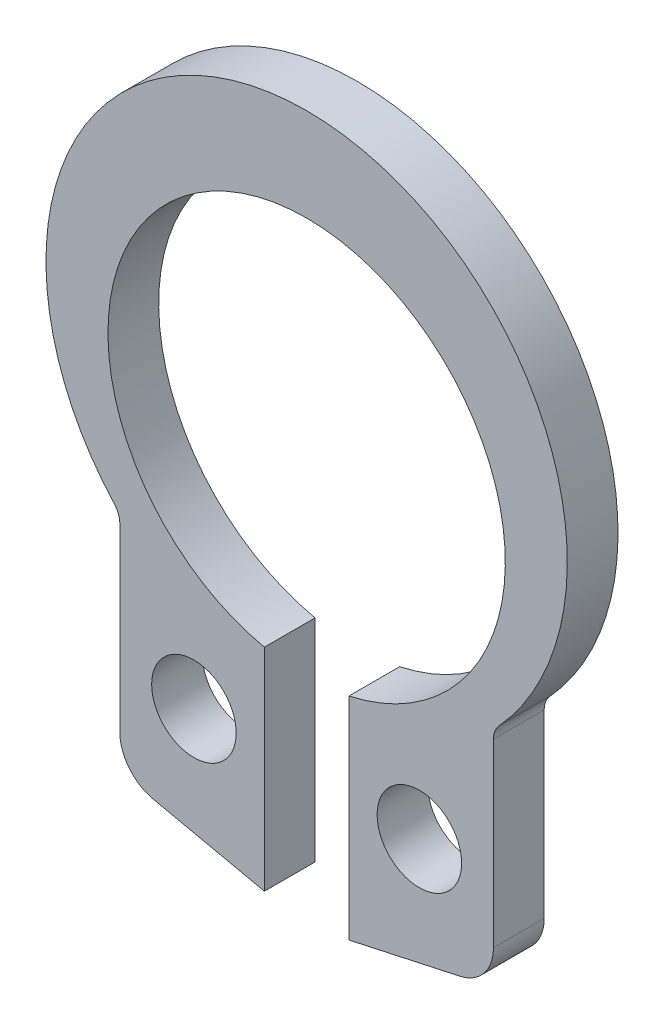
ISO-10303-21;
HEADER;
FILE_DESCRIPTION(('STEP AP214'),'2;1');
FILE_NAME('part.step','',(''),(''),'','','');
FILE_SCHEMA(('AUTOMOTIVE_DESIGN { 1 0 10303 214 1 1 1 1 }'));
ENDSEC;
DATA;
#1=APPLICATION_CONTEXT('core data for automotive mechanical design processes');
#2=APPLICATION_PROTOCOL_DEFINITION('international standard','automotive_design',2000,#1);
#3=PRODUCT_CONTEXT('',#1,'mechanical');
#4=PRODUCT('Part','Part','',(#3));
#5=PRODUCT_RELATED_PRODUCT_CATEGORY('part','',(#4));
#6=PRODUCT_DEFINITION_FORMATION('','',#4);
#7=PRODUCT_DEFINITION_CONTEXT('part definition',#1,'design');
#8=PRODUCT_DEFINITION('design','',#6,#7);
#9=PRODUCT_DEFINITION_SHAPE('','',#8);
#10=(LENGTH_UNIT() NAMED_UNIT(*) SI_UNIT(.MILLI.,.METRE.));
#11=(NAMED_UNIT(*) PLANE_ANGLE_UNIT() SI_UNIT($,.RADIAN.));
#12=(NAMED_UNIT(*) SI_UNIT($,.STERADIAN.) SOLID_ANGLE_UNIT());
#13=UNCERTAINTY_MEASURE_WITH_UNIT(LENGTH_MEASURE(1.E-05),#10,'distance_accuracy_value','');
#14=(GEOMETRIC_REPRESENTATION_CONTEXT(3) GLOBAL_UNCERTAINTY_ASSIGNED_CONTEXT((#13)) GLOBAL_UNIT_ASSIGNED_CONTEXT((#10,
#11,#12)) REPRESENTATION_CONTEXT('',''));
#15=CARTESIAN_POINT('',(0.,0.,0.));
#16=DIRECTION('',(0.,0.,1.));
#17=DIRECTION('',(1.,0.,0.));
#18=AXIS2_PLACEMENT_3D('',#15,#16,#17);
#19=CARTESIAN_POINT('',(1.70993058558373,-4.02101128552295,-0.3));
#20=DIRECTION('',(0.,0.,1.));
#21=DIRECTION('',(1.,0.,0.));
#22=AXIS2_PLACEMENT_3D('',#19,#20,#21);
#23=CYLINDRICAL_SURFACE('',#22,0.5);
#24=CARTESIAN_POINT('',(1.70993058558373,-4.02101128552295,-0.3));
#25=DIRECTION('',(0.,0.,-1.));
#26=DIRECTION('',(-1.,0.,0.));
#27=AXIS2_PLACEMENT_3D('',#24,#25,#26);
#28=CIRCLE('',#27,0.5);
#29=CARTESIAN_POINT('',(2.20993058558373,-4.02101128552295,-0.3));
#30=VERTEX_POINT('',#29);
#31=CARTESIAN_POINT('',(1.81631356430713,-4.50956288140402,-0.3));
#32=VERTEX_POINT('',#31);
#33=EDGE_CURVE('E242',#30,#32,#28,.T.);
#34=ORIENTED_EDGE('',*,*,#33,.F.);
#35=DIRECTION('',(0.,0.,-1.));
#36=VECTOR('',#35,1.);
#37=CARTESIAN_POINT('',(2.20993058558373,-4.02101128552295,-0.3));
#38=LINE('',#37,#36);
#39=CARTESIAN_POINT('',(2.20993058558373,-4.02101128552295,0.3));
#40=VERTEX_POINT('',#39);
#41=EDGE_CURVE('E110',#40,#30,#38,.T.);
#42=ORIENTED_EDGE('',*,*,#41,.F.);
#43=CARTESIAN_POINT('',(1.70993058558373,-4.02101128552295,0.3));
#44=DIRECTION('',(0.,0.,1.));
#45=DIRECTION('',(-1.,0.,0.));
#46=AXIS2_PLACEMENT_3D('',#43,#44,#45);
#47=CIRCLE('',#46,0.5);
#48=CARTESIAN_POINT('',(1.81631356430713,-4.50956288140402,0.3));
#49=VERTEX_POINT('',#48);
#50=EDGE_CURVE('E266',#49,#40,#47,.T.);
#51=ORIENTED_EDGE('',*,*,#50,.F.);
#52=DIRECTION('',(0.,0.,1.));
#53=VECTOR('',#52,1.);
#54=CARTESIAN_POINT('',(1.81631356430713,-4.50956288140402,-0.3));
#55=LINE('',#54,#53);
#56=EDGE_CURVE('E10',#32,#49,#55,.T.);
#57=ORIENTED_EDGE('',*,*,#56,.F.);
#58=EDGE_LOOP('',(#34,#42,#51,#57));
#59=FACE_BOUND('',#58,.T.);
#60=ADVANCED_FACE('F15',(#59),#23,.T.);
#61=CARTESIAN_POINT('',(2.45993058558373,-1.88274495089487,0.3));
#62=DIRECTION('',(0.,0.,-1.));
#63=DIRECTION('',(-1.,0.,0.));
#64=AXIS2_PLACEMENT_3D('',#61,#62,#63);
#65=CYLINDRICAL_SURFACE('',#64,0.25);
#66=CARTESIAN_POINT('',(2.45993058558373,-1.88274495089487,-0.3));
#67=DIRECTION('',(0.,0.,1.));
#68=DIRECTION('',(-1.,0.,0.));
#69=AXIS2_PLACEMENT_3D('',#66,#67,#68);
#70=CIRCLE('',#69,0.25);
#71=CARTESIAN_POINT('',(2.27543579166495,-1.71403907957775,-0.3));
#72=VERTEX_POINT('',#71);
#73=CARTESIAN_POINT('',(2.20993058558373,-1.88274495089487,-0.3));
#74=VERTEX_POINT('',#73);
#75=EDGE_CURVE('E165',#72,#74,#70,.T.);
#76=ORIENTED_EDGE('',*,*,#75,.F.);
#77=DIRECTION('',(0.,0.,-1.));
#78=VECTOR('',#77,1.);
#79=CARTESIAN_POINT('',(2.27543579166495,-1.71403907957775,0.3));
#80=LINE('',#79,#78);
#81=CARTESIAN_POINT('',(2.27543579166495,-1.71403907957775,0.3));
#82=VERTEX_POINT('',#81);
#83=EDGE_CURVE('E169',#82,#72,#80,.T.);
#84=ORIENTED_EDGE('',*,*,#83,.F.);
#85=CARTESIAN_POINT('',(2.45993058558373,-1.88274495089487,0.3));
#86=DIRECTION('',(0.,0.,-1.));
#87=DIRECTION('',(-1.,0.,0.));
#88=AXIS2_PLACEMENT_3D('',#85,#86,#87);
#89=CIRCLE('',#88,0.25);
#90=CARTESIAN_POINT('',(2.20993058558373,-1.88274495089487,0.3));
#91=VERTEX_POINT('',#90);
#92=EDGE_CURVE('E162',#91,#82,#89,.T.);
#93=ORIENTED_EDGE('',*,*,#92,.F.);
#94=DIRECTION('',(0.,0.,1.));
#95=VECTOR('',#94,1.);
#96=CARTESIAN_POINT('',(2.20993058558373,-1.88274495089487,-0.3));
#97=LINE('',#96,#95);
#98=EDGE_CURVE('E26',#74,#91,#97,.T.);
#99=ORIENTED_EDGE('',*,*,#98,.F.);
#100=EDGE_LOOP('',(#76,#84,#93,#99));
#101=FACE_BOUND('',#100,.T.);
#102=ADVANCED_FACE('F167',(#101),#65,.F.);
#103=CARTESIAN_POINT('',(1.33333333333333,-3.34398298772919,2.5));
#104=DIRECTION('',(0.,0.,-1.));
#105=DIRECTION('',(-1.,0.,0.));
#106=AXIS2_PLACEMENT_3D('',#103,#104,#105);
#107=CYLINDRICAL_SURFACE('',#106,0.5);
#108=CARTESIAN_POINT('',(1.33333333333333,-3.34398298772919,0.3));
#109=DIRECTION('',(0.,0.,-1.));
#110=DIRECTION('',(-1.,0.,0.));
#111=AXIS2_PLACEMENT_3D('',#108,#109,#110);
#112=CIRCLE('',#111,0.5);
#113=CARTESIAN_POINT('',(0.833333333333332,-3.34398298772919,0.3));
#114=VERTEX_POINT('',#113);
#115=EDGE_CURVE('E204',#114,#114,#112,.T.);
#116=ORIENTED_EDGE('',*,*,#115,.F.);
#117=EDGE_LOOP('',(#116));
#118=FACE_BOUND('',#117,.T.);
#119=CARTESIAN_POINT('',(1.33333333333333,-3.34398298772919,-0.3));
#120=DIRECTION('',(0.,0.,-1.));
#121=DIRECTION('',(-1.,0.,0.));
#122=AXIS2_PLACEMENT_3D('',#119,#120,#121);
#123=CIRCLE('',#122,0.5);
#124=CARTESIAN_POINT('',(0.833333333333332,-3.34398298772919,-0.3));
#125=VERTEX_POINT('',#124);
#126=EDGE_CURVE('E221',#125,#125,#123,.T.);
#127=ORIENTED_EDGE('',*,*,#126,.T.);
#128=EDGE_LOOP('',(#127));
#129=FACE_BOUND('',#128,.T.);
#130=ADVANCED_FACE('F390',(#118,#129),#107,.F.);
#131=CARTESIAN_POINT('',(2.20993058558373,-4.42385207510909,-0.3));
#132=DIRECTION('',(-0.212765957446809,0.97710319176213,0.));
#133=DIRECTION('',(0.,0.,1.));
#134=AXIS2_PLACEMENT_3D('',#131,#132,#133);
#135=PLANE('',#134);
#136=DIRECTION('',(-0.977103191762131,-0.212765957446809,0.));
#137=VECTOR('',#136,1.);
#138=CARTESIAN_POINT('',(2.20993058558373,-4.42385207510909,-0.3));
#139=LINE('',#138,#137);
#140=CARTESIAN_POINT('',(0.5,-4.79619250064101,-0.3));
#141=VERTEX_POINT('',#140);
#142=EDGE_CURVE('E209',#32,#141,#139,.T.);
#143=ORIENTED_EDGE('',*,*,#142,.F.);
#144=ORIENTED_EDGE('',*,*,#56,.T.);
#145=DIRECTION('',(-0.977103191762131,-0.212765957446809,0.));
#146=VECTOR('',#145,1.);
#147=CARTESIAN_POINT('',(2.20993058558373,-4.42385207510909,0.3));
#148=LINE('',#147,#146);
#149=CARTESIAN_POINT('',(0.5,-4.79619250064101,0.3));
#150=VERTEX_POINT('',#149);
#151=EDGE_CURVE('E203',#49,#150,#148,.T.);
#152=ORIENTED_EDGE('',*,*,#151,.T.);
#153=DIRECTION('',(0.,0.,1.));
#154=VECTOR('',#153,1.);
#155=CARTESIAN_POINT('',(0.5,-4.79619250064101,-0.3));
#156=LINE('',#155,#154);
#157=EDGE_CURVE('E125',#141,#150,#156,.T.);
#158=ORIENTED_EDGE('',*,*,#157,.F.);
#159=EDGE_LOOP('',(#143,#144,#152,#158));
#160=FACE_BOUND('',#159,.T.);
#161=ADVANCED_FACE('F380',(#160),#135,.F.);
#162=CARTESIAN_POINT('',(2.20993058558373,-1.78348478180063,-0.3));
#163=DIRECTION('',(-1.,0.,0.));
#164=DIRECTION('',(0.,0.,1.));
#165=AXIS2_PLACEMENT_3D('',#162,#163,#164);
#166=PLANE('',#165);
#167=DIRECTION('',(0.,-1.,0.));
#168=VECTOR('',#167,1.);
#169=CARTESIAN_POINT('',(2.20993058558373,-1.78348478180063,0.3));
#170=LINE('',#169,#168);
#171=EDGE_CURVE('E258',#91,#40,#170,.T.);
#172=ORIENTED_EDGE('',*,*,#171,.T.);
#173=ORIENTED_EDGE('',*,*,#41,.T.);
#174=DIRECTION('',(0.,-1.,0.));
#175=VECTOR('',#174,1.);
#176=CARTESIAN_POINT('',(2.20993058558373,-1.78348478180063,-0.3));
#177=LINE('',#176,#175);
#178=EDGE_CURVE('E240',#74,#30,#177,.T.);
#179=ORIENTED_EDGE('',*,*,#178,.F.);
#180=ORIENTED_EDGE('',*,*,#98,.T.);
#181=EDGE_LOOP('',(#172,#173,#179,#180));
#182=FACE_BOUND('',#181,.T.);
#183=ADVANCED_FACE('F382',(#182),#166,.F.);
#184=CARTESIAN_POINT('',(-1.70993058558373,-4.02101128552295,-0.3));
#185=DIRECTION('',(0.,0.,1.));
#186=DIRECTION('',(1.,0.,0.));
#187=AXIS2_PLACEMENT_3D('',#184,#185,#186);
#188=CYLINDRICAL_SURFACE('',#187,0.5);
#189=CARTESIAN_POINT('',(-1.70993058558373,-4.02101128552295,-0.3));
#190=DIRECTION('',(0.,0.,-1.));
#191=DIRECTION('',(-1.,0.,0.));
#192=AXIS2_PLACEMENT_3D('',#189,#190,#191);
#193=CIRCLE('',#192,0.5);
#194=CARTESIAN_POINT('',(-1.81631356430713,-4.50956288140402,-0.3));
#195=VERTEX_POINT('',#194);
#196=CARTESIAN_POINT('',(-2.20993058558373,-4.02101128552295,-0.3));
#197=VERTEX_POINT('',#196);
#198=EDGE_CURVE('E226',#195,#197,#193,.T.);
#199=ORIENTED_EDGE('',*,*,#198,.F.);
#200=DIRECTION('',(0.,0.,-1.));
#201=VECTOR('',#200,1.);
#202=CARTESIAN_POINT('',(-1.81631356430713,-4.50956288140402,-0.3));
#203=LINE('',#202,#201);
#204=CARTESIAN_POINT('',(-1.81631356430713,-4.50956288140402,0.3));
#205=VERTEX_POINT('',#204);
#206=EDGE_CURVE('E230',#205,#195,#203,.T.);
#207=ORIENTED_EDGE('',*,*,#206,.F.);
#208=CARTESIAN_POINT('',(-1.70993058558373,-4.02101128552295,0.3));
#209=DIRECTION('',(0.,0.,1.));
#210=DIRECTION('',(-1.,0.,0.));
#211=AXIS2_PLACEMENT_3D('',#208,#209,#210);
#212=CIRCLE('',#211,0.5);
#213=CARTESIAN_POINT('',(-2.20993058558373,-4.02101128552295,0.3));
#214=VERTEX_POINT('',#213);
#215=EDGE_CURVE('E273',#214,#205,#212,.T.);
#216=ORIENTED_EDGE('',*,*,#215,.F.);
#217=DIRECTION('',(0.,0.,1.));
#218=VECTOR('',#217,1.);
#219=CARTESIAN_POINT('',(-2.20993058558373,-4.02101128552295,-0.3));
#220=LINE('',#219,#218);
#221=EDGE_CURVE('E227',#197,#214,#220,.T.);
#222=ORIENTED_EDGE('',*,*,#221,.F.);
#223=EDGE_LOOP('',(#199,#207,#216,#222));
#224=FACE_BOUND('',#223,.T.);
#225=ADVANCED_FACE('F322',(#224),#188,.T.);
#226=CARTESIAN_POINT('',(-2.45993058558373,-1.88274495089487,0.3));
#227=DIRECTION('',(0.,0.,-1.));
#228=DIRECTION('',(-1.,0.,0.));
#229=AXIS2_PLACEMENT_3D('',#226,#227,#228);
#230=CYLINDRICAL_SURFACE('',#229,0.25);
#231=CARTESIAN_POINT('',(-2.45993058558373,-1.88274495089487,-0.3));
#232=DIRECTION('',(0.,0.,1.));
#233=DIRECTION('',(-1.,0.,0.));
#234=AXIS2_PLACEMENT_3D('',#231,#232,#233);
#235=CIRCLE('',#234,0.25);
#236=CARTESIAN_POINT('',(-2.20993058558373,-1.88274495089487,-0.3));
#237=VERTEX_POINT('',#236);
#238=CARTESIAN_POINT('',(-2.27543579166495,-1.71403907957775,-0.3));
#239=VERTEX_POINT('',#238);
#240=EDGE_CURVE('E175',#237,#239,#235,.T.);
#241=ORIENTED_EDGE('',*,*,#240,.F.);
#242=DIRECTION('',(0.,0.,-1.));
#243=VECTOR('',#242,1.);
#244=CARTESIAN_POINT('',(-2.20993058558373,-1.88274495089487,-0.3));
#245=LINE('',#244,#243);
#246=CARTESIAN_POINT('',(-2.20993058558373,-1.88274495089487,0.3));
#247=VERTEX_POINT('',#246);
#248=EDGE_CURVE('E40',#247,#237,#245,.T.);
#249=ORIENTED_EDGE('',*,*,#248,.F.);
#250=CARTESIAN_POINT('',(-2.45993058558373,-1.88274495089487,0.3));
#251=DIRECTION('',(0.,0.,-1.));
#252=DIRECTION('',(-1.,0.,0.));
#253=AXIS2_PLACEMENT_3D('',#250,#251,#252);
#254=CIRCLE('',#253,0.25);
#255=CARTESIAN_POINT('',(-2.27543579166495,-1.71403907957775,0.3));
#256=VERTEX_POINT('',#255);
#257=EDGE_CURVE('E257',#256,#247,#254,.T.);
#258=ORIENTED_EDGE('',*,*,#257,.F.);
#259=DIRECTION('',(0.,0.,1.));
#260=VECTOR('',#259,1.);
#261=CARTESIAN_POINT('',(-2.27543579166495,-1.71403907957775,0.3));
#262=LINE('',#261,#260);
#263=EDGE_CURVE('E186',#239,#256,#262,.T.);
#264=ORIENTED_EDGE('',*,*,#263,.F.);
#265=EDGE_LOOP('',(#241,#249,#258,#264));
#266=FACE_BOUND('',#265,.T.);
#267=ADVANCED_FACE('F317',(#266),#230,.F.);
#268=CARTESIAN_POINT('',(-1.33333333333333,-3.34398298772919,2.5));
#269=DIRECTION('',(0.,0.,-1.));
#270=DIRECTION('',(-1.,0.,0.));
#271=AXIS2_PLACEMENT_3D('',#268,#269,#270);
#272=CYLINDRICAL_SURFACE('',#271,0.5);
#273=CARTESIAN_POINT('',(-1.33333333333333,-3.34398298772919,0.3));
#274=DIRECTION('',(0.,0.,-1.));
#275=DIRECTION('',(-1.,0.,0.));
#276=AXIS2_PLACEMENT_3D('',#273,#274,#275);
#277=CIRCLE('',#276,0.5);
#278=CARTESIAN_POINT('',(-1.83333333333333,-3.34398298772919,0.3));
#279=VERTEX_POINT('',#278);
#280=EDGE_CURVE('E200',#279,#279,#277,.T.);
#281=ORIENTED_EDGE('',*,*,#280,.F.);
#282=EDGE_LOOP('',(#281));
#283=FACE_BOUND('',#282,.T.);
#284=CARTESIAN_POINT('',(-1.33333333333333,-3.34398298772919,-0.3));
#285=DIRECTION('',(0.,0.,-1.));
#286=DIRECTION('',(-1.,0.,0.));
#287=AXIS2_PLACEMENT_3D('',#284,#285,#286);
#288=CIRCLE('',#287,0.5);
#289=CARTESIAN_POINT('',(-1.83333333333333,-3.34398298772919,-0.3));
#290=VERTEX_POINT('',#289);
#291=EDGE_CURVE('E83',#290,#290,#288,.T.);
#292=ORIENTED_EDGE('',*,*,#291,.T.);
#293=EDGE_LOOP('',(#292));
#294=FACE_BOUND('',#293,.T.);
#295=ADVANCED_FACE('F401',(#283,#294),#272,.F.);
#296=CARTESIAN_POINT('',(-2.20993058558373,-4.42385207510909,-0.3));
#297=DIRECTION('',(1.,0.,0.));
#298=DIRECTION('',(0.,1.,0.));
#299=AXIS2_PLACEMENT_3D('',#296,#297,#298);
#300=PLANE('',#299);
#301=DIRECTION('',(0.,1.,0.));
#302=VECTOR('',#301,1.);
#303=CARTESIAN_POINT('',(-2.20993058558373,-4.42385207510909,-0.3));
#304=LINE('',#303,#302);
#305=EDGE_CURVE('E223',#197,#237,#304,.T.);
#306=ORIENTED_EDGE('',*,*,#305,.F.);
#307=ORIENTED_EDGE('',*,*,#221,.T.);
#308=DIRECTION('',(0.,1.,0.));
#309=VECTOR('',#308,1.);
#310=CARTESIAN_POINT('',(-2.20993058558373,-4.42385207510909,0.3));
#311=LINE('',#310,#309);
#312=EDGE_CURVE('E298',#214,#247,#311,.T.);
#313=ORIENTED_EDGE('',*,*,#312,.T.);
#314=ORIENTED_EDGE('',*,*,#248,.T.);
#315=EDGE_LOOP('',(#306,#307,#313,#314));
#316=FACE_BOUND('',#315,.T.);
#317=ADVANCED_FACE('F311',(#316),#300,.F.);
#318=CARTESIAN_POINT('',(-0.5,-4.79619250064101,-0.3));
#319=DIRECTION('',(0.212765957446809,0.97710319176213,0.));
#320=DIRECTION('',(0.,0.,-1.));
#321=AXIS2_PLACEMENT_3D('',#318,#319,#320);
#322=PLANE('',#321);
#323=DIRECTION('',(-0.977103191762131,0.212765957446809,0.));
#324=VECTOR('',#323,1.);
#325=CARTESIAN_POINT('',(-0.5,-4.79619250064101,0.3));
#326=LINE('',#325,#324);
#327=CARTESIAN_POINT('',(-0.5,-4.79619250064101,0.3));
#328=VERTEX_POINT('',#327);
#329=EDGE_CURVE('E269',#328,#205,#326,.T.);
#330=ORIENTED_EDGE('',*,*,#329,.T.);
#331=ORIENTED_EDGE('',*,*,#206,.T.);
#332=DIRECTION('',(-0.977103191762131,0.212765957446809,0.));
#333=VECTOR('',#332,1.);
#334=CARTESIAN_POINT('',(-0.5,-4.79619250064101,-0.3));
#335=LINE('',#334,#333);
#336=CARTESIAN_POINT('',(-0.5,-4.79619250064101,-0.3));
#337=VERTEX_POINT('',#336);
#338=EDGE_CURVE('E212',#337,#195,#335,.T.);
#339=ORIENTED_EDGE('',*,*,#338,.F.);
#340=DIRECTION('',(0.,0.,1.));
#341=VECTOR('',#340,1.);
#342=CARTESIAN_POINT('',(-0.5,-4.79619250064101,-0.3));
#343=LINE('',#342,#341);
#344=EDGE_CURVE('E262',#337,#328,#343,.T.);
#345=ORIENTED_EDGE('',*,*,#344,.T.);
#346=EDGE_LOOP('',(#330,#331,#339,#345));
#347=FACE_BOUND('',#346,.T.);
#348=ADVANCED_FACE('F17',(#347),#322,.F.);
#349=CARTESIAN_POINT('',(-0.5,-2.71666666666667,2.8));
#350=DIRECTION('',(-1.,0.,0.));
#351=DIRECTION('',(0.,1.,0.));
#352=AXIS2_PLACEMENT_3D('',#349,#350,#351);
#353=PLANE('',#352);
#354=DIRECTION('',(0.,1.,0.));
#355=VECTOR('',#354,1.);
#356=CARTESIAN_POINT('',(-0.5,0.366666666666666,0.3));
#357=LINE('',#356,#355);
#358=CARTESIAN_POINT('',(-0.5,-2.29619250064101,0.3));
#359=VERTEX_POINT('',#358);
#360=EDGE_CURVE('E222',#328,#359,#357,.T.);
#361=ORIENTED_EDGE('',*,*,#360,.F.);
#362=ORIENTED_EDGE('',*,*,#344,.F.);
#363=DIRECTION('',(0.,1.,0.));
#364=VECTOR('',#363,1.);
#365=CARTESIAN_POINT('',(-0.5,0.366666666666666,-0.3));
#366=LINE('',#365,#364);
#367=CARTESIAN_POINT('',(-0.5,-2.29619250064101,-0.3));
#368=VERTEX_POINT('',#367);
#369=EDGE_CURVE('E208',#337,#368,#366,.T.);
#370=ORIENTED_EDGE('',*,*,#369,.T.);
#371=DIRECTION('',(0.,0.,-1.));
#372=VECTOR('',#371,1.);
#373=CARTESIAN_POINT('',(-0.5,-2.29619250064101,0.3));
#374=LINE('',#373,#372);
#375=EDGE_CURVE('E213',#359,#368,#374,.T.);
#376=ORIENTED_EDGE('',*,*,#375,.F.);
#377=EDGE_LOOP('',(#361,#362,#370,#376));
#378=FACE_BOUND('',#377,.T.);
#379=ADVANCED_FACE('F372',(#378),#353,.F.);
#380=CARTESIAN_POINT('',(0.5,0.,2.8));
#381=DIRECTION('',(1.,0.,0.));
#382=DIRECTION('',(0.,1.,0.));
#383=AXIS2_PLACEMENT_3D('',#380,#381,#382);
#384=PLANE('',#383);
#385=DIRECTION('',(0.,0.,1.));
#386=VECTOR('',#385,1.);
#387=CARTESIAN_POINT('',(0.5,-2.29619250064101,0.3));
#388=LINE('',#387,#386);
#389=CARTESIAN_POINT('',(0.5,-2.29619250064101,-0.3));
#390=VERTEX_POINT('',#389);
#391=CARTESIAN_POINT('',(0.5,-2.29619250064101,0.3));
#392=VERTEX_POINT('',#391);
#393=EDGE_CURVE('E233',#390,#392,#388,.T.);
#394=ORIENTED_EDGE('',*,*,#393,.F.);
#395=DIRECTION('',(0.,-1.,0.));
#396=VECTOR('',#395,1.);
#397=CARTESIAN_POINT('',(0.5,0.366666666666667,-0.3));
#398=LINE('',#397,#396);
#399=EDGE_CURVE('E205',#390,#141,#398,.T.);
#400=ORIENTED_EDGE('',*,*,#399,.T.);
#401=ORIENTED_EDGE('',*,*,#157,.T.);
#402=DIRECTION('',(0.,-1.,0.));
#403=VECTOR('',#402,1.);
#404=CARTESIAN_POINT('',(0.5,0.366666666666667,0.3));
#405=LINE('',#404,#403);
#406=EDGE_CURVE('E218',#392,#150,#405,.T.);
#407=ORIENTED_EDGE('',*,*,#406,.F.);
#408=EDGE_LOOP('',(#394,#400,#401,#407));
#409=FACE_BOUND('',#408,.T.);
#410=ADVANCED_FACE('F378',(#409),#384,.F.);
#411=CARTESIAN_POINT('',(0.,0.366666666666667,-0.3));
#412=DIRECTION('',(0.,0.,-1.));
#413=DIRECTION('',(0.,-1.,0.));
#414=AXIS2_PLACEMENT_3D('',#411,#412,#413);
#415=PLANE('',#414);
#416=ORIENTED_EDGE('',*,*,#178,.T.);
#417=ORIENTED_EDGE('',*,*,#33,.T.);
#418=ORIENTED_EDGE('',*,*,#142,.T.);
#419=ORIENTED_EDGE('',*,*,#399,.F.);
#420=CARTESIAN_POINT('',(0.,0.,-0.3));
#421=DIRECTION('',(0.,0.,-1.));
#422=DIRECTION('',(1.,0.,0.));
#423=AXIS2_PLACEMENT_3D('',#420,#421,#422);
#424=CIRCLE('',#423,2.35);
#425=EDGE_CURVE('E19',#368,#390,#424,.T.);
#426=ORIENTED_EDGE('',*,*,#425,.F.);
#427=ORIENTED_EDGE('',*,*,#369,.F.);
#428=ORIENTED_EDGE('',*,*,#338,.T.);
#429=ORIENTED_EDGE('',*,*,#198,.T.);
#430=ORIENTED_EDGE('',*,*,#305,.T.);
#431=ORIENTED_EDGE('',*,*,#240,.T.);
#432=CARTESIAN_POINT('',(0.,0.366666666666667,-0.3));
#433=DIRECTION('',(0.,0.,-1.));
#434=DIRECTION('',(1.,0.,0.));
#435=AXIS2_PLACEMENT_3D('',#432,#433,#434);
#436=CIRCLE('',#435,3.08333333333333);
#437=EDGE_CURVE('E178',#239,#72,#436,.T.);
#438=ORIENTED_EDGE('',*,*,#437,.T.);
#439=ORIENTED_EDGE('',*,*,#75,.T.);
#440=EDGE_LOOP('',(#416,#417,#418,#419,#426,#427,#428,#429,#430,#431,#438,#439));
#441=FACE_BOUND('',#440,.T.);
#442=ORIENTED_EDGE('',*,*,#291,.F.);
#443=EDGE_LOOP('',(#442));
#444=FACE_BOUND('',#443,.T.);
#445=ORIENTED_EDGE('',*,*,#126,.F.);
#446=EDGE_LOOP('',(#445));
#447=FACE_BOUND('',#446,.T.);
#448=ADVANCED_FACE('F179',(#441,#444,#447),#415,.T.);
#449=CARTESIAN_POINT('',(0.,0.366666666666667,0.3));
#450=DIRECTION('',(0.,0.,-1.));
#451=DIRECTION('',(0.,-1.,0.));
#452=AXIS2_PLACEMENT_3D('',#449,#450,#451);
#453=PLANE('',#452);
#454=ORIENTED_EDGE('',*,*,#151,.F.);
#455=ORIENTED_EDGE('',*,*,#50,.T.);
#456=ORIENTED_EDGE('',*,*,#171,.F.);
#457=ORIENTED_EDGE('',*,*,#92,.T.);
#458=CARTESIAN_POINT('',(0.,0.366666666666667,0.3));
#459=DIRECTION('',(0.,0.,-1.));
#460=DIRECTION('',(1.,0.,0.));
#461=AXIS2_PLACEMENT_3D('',#458,#459,#460);
#462=CIRCLE('',#461,3.08333333333333);
#463=EDGE_CURVE('E189',#256,#82,#462,.T.);
#464=ORIENTED_EDGE('',*,*,#463,.F.);
#465=ORIENTED_EDGE('',*,*,#257,.T.);
#466=ORIENTED_EDGE('',*,*,#312,.F.);
#467=ORIENTED_EDGE('',*,*,#215,.T.);
#468=ORIENTED_EDGE('',*,*,#329,.F.);
#469=ORIENTED_EDGE('',*,*,#360,.T.);
#470=CARTESIAN_POINT('',(0.,0.,0.3));
#471=DIRECTION('',(0.,0.,-1.));
#472=DIRECTION('',(1.,0.,0.));
#473=AXIS2_PLACEMENT_3D('',#470,#471,#472);
#474=CIRCLE('',#473,2.35);
#475=EDGE_CURVE('E217',#359,#392,#474,.T.);
#476=ORIENTED_EDGE('',*,*,#475,.T.);
#477=ORIENTED_EDGE('',*,*,#406,.T.);
#478=EDGE_LOOP('',(#454,#455,#456,#457,#464,#465,#466,#467,#468,#469,#476,#477));
#479=FACE_BOUND('',#478,.T.);
#480=ORIENTED_EDGE('',*,*,#280,.T.);
#481=EDGE_LOOP('',(#480));
#482=FACE_BOUND('',#481,.T.);
#483=ORIENTED_EDGE('',*,*,#115,.T.);
#484=EDGE_LOOP('',(#483));
#485=FACE_BOUND('',#484,.T.);
#486=ADVANCED_FACE('F314',(#479,#482,#485),#453,.F.);
#487=CARTESIAN_POINT('',(0.,0.,0.3));
#488=DIRECTION('',(0.,0.,-1.));
#489=DIRECTION('',(-1.,0.,0.));
#490=AXIS2_PLACEMENT_3D('',#487,#488,#489);
#491=CYLINDRICAL_SURFACE('',#490,2.35);
#492=ORIENTED_EDGE('',*,*,#475,.F.);
#493=ORIENTED_EDGE('',*,*,#375,.T.);
#494=ORIENTED_EDGE('',*,*,#425,.T.);
#495=ORIENTED_EDGE('',*,*,#393,.T.);
#496=EDGE_LOOP('',(#492,#493,#494,#495));
#497=FACE_BOUND('',#496,.T.);
#498=ADVANCED_FACE('F376',(#497),#491,.F.);
#499=CARTESIAN_POINT('',(0.,0.366666666666667,0.3));
#500=DIRECTION('',(0.,0.,-1.));
#501=DIRECTION('',(-1.,0.,0.));
#502=AXIS2_PLACEMENT_3D('',#499,#500,#501);
#503=CYLINDRICAL_SURFACE('',#502,3.08333333333333);
#504=ORIENTED_EDGE('',*,*,#463,.T.);
#505=ORIENTED_EDGE('',*,*,#83,.T.);
#506=ORIENTED_EDGE('',*,*,#437,.F.);
#507=ORIENTED_EDGE('',*,*,#263,.T.);
#508=EDGE_LOOP('',(#504,#505,#506,#507));
#509=FACE_BOUND('',#508,.T.);
#510=ADVANCED_FACE('F188',(#509),#503,.T.);
#511=CLOSED_SHELL('',(#60,#102,#130,#161,#183,#225,#267,#295,#317,#348,#379,#410,#448,#486,#498,#510));
#512=MANIFOLD_SOLID_BREP('B1',#511);
#513=ADVANCED_BREP_SHAPE_REPRESENTATION('',(#18,#512),#14);
#514=SHAPE_DEFINITION_REPRESENTATION(#9,#513);
ENDSEC;
END-ISO-10303-21;
